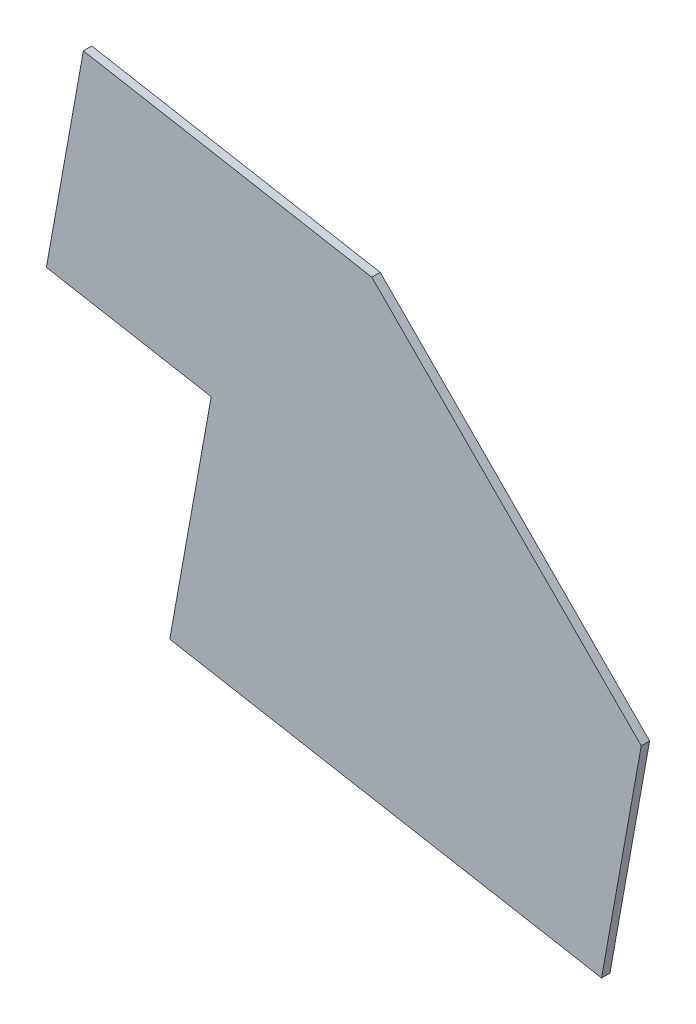
ISO-10303-21;
HEADER;
FILE_DESCRIPTION(('STEP AP214'),'2;1');
FILE_NAME('part.step','',(''),(''),'','','');
FILE_SCHEMA(('AUTOMOTIVE_DESIGN { 1 0 10303 214 1 1 1 1 }'));
ENDSEC;
DATA;
#1=APPLICATION_CONTEXT('core data for automotive mechanical design processes');
#2=APPLICATION_PROTOCOL_DEFINITION('international standard','automotive_design',2000,#1);
#3=PRODUCT_CONTEXT('',#1,'mechanical');
#4=PRODUCT('Part','Part','',(#3));
#5=PRODUCT_RELATED_PRODUCT_CATEGORY('part','',(#4));
#6=PRODUCT_DEFINITION_FORMATION('','',#4);
#7=PRODUCT_DEFINITION_CONTEXT('part definition',#1,'design');
#8=PRODUCT_DEFINITION('design','',#6,#7);
#9=PRODUCT_DEFINITION_SHAPE('','',#8);
#10=(LENGTH_UNIT() NAMED_UNIT(*) SI_UNIT(.MILLI.,.METRE.));
#11=(NAMED_UNIT(*) PLANE_ANGLE_UNIT() SI_UNIT($,.RADIAN.));
#12=(NAMED_UNIT(*) SI_UNIT($,.STERADIAN.) SOLID_ANGLE_UNIT());
#13=UNCERTAINTY_MEASURE_WITH_UNIT(LENGTH_MEASURE(1.E-05),#10,'distance_accuracy_value','');
#14=(GEOMETRIC_REPRESENTATION_CONTEXT(3) GLOBAL_UNCERTAINTY_ASSIGNED_CONTEXT((#13)) GLOBAL_UNIT_ASSIGNED_CONTEXT((#10,
#11,#12)) REPRESENTATION_CONTEXT('',''));
#15=CARTESIAN_POINT('',(0.,0.,0.));
#16=DIRECTION('',(0.,0.,1.));
#17=DIRECTION('',(1.,0.,0.));
#18=AXIS2_PLACEMENT_3D('',#15,#16,#17);
#19=CARTESIAN_POINT('',(6.90259130912156,36.5974267215923,-9.14292260314349));
#20=DIRECTION('',(0.,0.,1.));
#21=DIRECTION('',(1.,0.,0.));
#22=AXIS2_PLACEMENT_3D('',#19,#20,#21);
#23=PLANE('',#22);
#24=DIRECTION('',(0.704896981963478,-0.709309695985315,0.));
#25=VECTOR('',#24,1.);
#26=CARTESIAN_POINT('',(12.4671356279618,42.4369671593034,-9.14292260314354));
#27=LINE('',#26,#25);
#28=CARTESIAN_POINT('',(16.5544350594565,38.3240808917542,-9.14292260314354));
#29=VERTEX_POINT('',#28);
#30=CARTESIAN_POINT('',(12.4671356279618,42.4369671593034,-9.14292260314352));
#31=VERTEX_POINT('',#30);
#32=EDGE_CURVE('E130',#29,#31,#27,.F.);
#33=ORIENTED_EDGE('',*,*,#32,.T.);
#34=DIRECTION('',(0.984261131481025,-0.176720188591154,0.));
#35=VECTOR('',#34,1.);
#36=CARTESIAN_POINT('',(8.09209489852861,43.2224883975911,-9.14292260314351));
#37=LINE('',#36,#35);
#38=CARTESIAN_POINT('',(8.09209489852861,43.2224883975911,-9.14292260314349));
#39=VERTEX_POINT('',#38);
#40=EDGE_CURVE('E137',#31,#39,#37,.F.);
#41=ORIENTED_EDGE('',*,*,#40,.T.);
#42=DIRECTION('',(0.176720188591154,0.984261131481025,0.));
#43=VECTOR('',#42,1.);
#44=CARTESIAN_POINT('',(7.53100829975169,40.0974593051388,-9.14292260314348));
#45=LINE('',#44,#43);
#46=CARTESIAN_POINT('',(7.53100829975169,40.0974593051388,-9.14292260314349));
#47=VERTEX_POINT('',#46);
#48=EDGE_CURVE('E92',#39,#47,#45,.F.);
#49=ORIENTED_EDGE('',*,*,#48,.T.);
#50=DIRECTION('',(-0.984261131481025,0.176720188591154,0.));
#51=VECTOR('',#50,1.);
#52=CARTESIAN_POINT('',(10.0310315737135,39.6485900261173,-9.14292260314349));
#53=LINE('',#52,#51);
#54=CARTESIAN_POINT('',(10.0310315737135,39.6485900261173,-9.14292260314349));
#55=VERTEX_POINT('',#54);
#56=EDGE_CURVE('E20',#47,#55,#53,.F.);
#57=ORIENTED_EDGE('',*,*,#56,.T.);
#58=DIRECTION('',(0.176720188591154,0.984261131481025,0.));
#59=VECTOR('',#58,1.);
#60=CARTESIAN_POINT('',(9.40261458308336,36.1485574425708,-9.1429226031435));
#61=LINE('',#60,#59);
#62=CARTESIAN_POINT('',(9.40261458308336,36.1485574425707,-9.14292260314351));
#63=VERTEX_POINT('',#62);
#64=EDGE_CURVE('E88',#55,#63,#61,.F.);
#65=ORIENTED_EDGE('',*,*,#64,.T.);
#66=DIRECTION('',(-0.984261131481025,0.176720188591154,0.));
#67=VECTOR('',#66,1.);
#68=CARTESIAN_POINT('',(15.9526755608633,34.9725199315343,-9.14292260314351));
#69=LINE('',#68,#67);
#70=CARTESIAN_POINT('',(15.9526755608633,34.9725199315343,-9.14292260314353));
#71=VERTEX_POINT('',#70);
#72=EDGE_CURVE('E117',#63,#71,#69,.F.);
#73=ORIENTED_EDGE('',*,*,#72,.T.);
#74=DIRECTION('',(-0.176720188591155,-0.984261131481025,0.));
#75=VECTOR('',#74,1.);
#76=CARTESIAN_POINT('',(16.5544350594565,38.3240808917542,-9.14292260314354));
#77=LINE('',#76,#75);
#78=EDGE_CURVE('E123',#71,#29,#77,.F.);
#79=ORIENTED_EDGE('',*,*,#78,.T.);
#80=EDGE_LOOP('',(#33,#41,#49,#57,#65,#73,#79));
#81=FACE_BOUND('',#80,.T.);
#82=ADVANCED_FACE('F17',(#81),#23,.T.);
#83=CARTESIAN_POINT('',(10.0310315737135,39.6485900261173,-9.2699226031435));
#84=DIRECTION('',(0.176720188591154,0.984261131481025,0.));
#85=DIRECTION('',(-0.984261131481025,0.176720188591154,0.));
#86=AXIS2_PLACEMENT_3D('',#83,#84,#85);
#87=PLANE('',#86);
#88=DIRECTION('',(0.,0.,1.));
#89=VECTOR('',#88,1.);
#90=CARTESIAN_POINT('',(7.53100829975169,40.0974593051388,-9.26992260314349));
#91=LINE('',#90,#89);
#92=CARTESIAN_POINT('',(7.53100829975169,40.0974593051388,-9.26992260314349));
#93=VERTEX_POINT('',#92);
#94=EDGE_CURVE('E140',#47,#93,#91,.F.);
#95=ORIENTED_EDGE('',*,*,#94,.T.);
#96=DIRECTION('',(0.984261131481024,-0.176720188591159,0.));
#97=VECTOR('',#96,1.);
#98=CARTESIAN_POINT('',(7.53100829975169,40.0974593051388,-9.26992260314348));
#99=LINE('',#98,#97);
#100=CARTESIAN_POINT('',(10.0310315737135,39.6485900261173,-9.2699226031435));
#101=VERTEX_POINT('',#100);
#102=EDGE_CURVE('E109',#93,#101,#99,.T.);
#103=ORIENTED_EDGE('',*,*,#102,.T.);
#104=DIRECTION('',(0.,0.,1.));
#105=VECTOR('',#104,1.);
#106=CARTESIAN_POINT('',(10.0310315737135,39.6485900261173,-9.26992260314351));
#107=LINE('',#106,#105);
#108=EDGE_CURVE('E98',#101,#55,#107,.T.);
#109=ORIENTED_EDGE('',*,*,#108,.T.);
#110=ORIENTED_EDGE('',*,*,#56,.F.);
#111=EDGE_LOOP('',(#95,#103,#109,#110));
#112=FACE_BOUND('',#111,.T.);
#113=ADVANCED_FACE('F108',(#112),#87,.F.);
#114=CARTESIAN_POINT('',(9.40261458308336,36.1485574425708,-9.26992260314351));
#115=DIRECTION('',(0.984261131481025,-0.176720188591154,0.));
#116=DIRECTION('',(0.176720188591154,0.984261131481025,0.));
#117=AXIS2_PLACEMENT_3D('',#114,#115,#116);
#118=PLANE('',#117);
#119=ORIENTED_EDGE('',*,*,#108,.F.);
#120=DIRECTION('',(-0.176720188591155,-0.984261131481024,0.));
#121=VECTOR('',#120,1.);
#122=CARTESIAN_POINT('',(10.0310315737135,39.6485900261173,-9.2699226031435));
#123=LINE('',#122,#121);
#124=CARTESIAN_POINT('',(9.40261458308336,36.1485574425707,-9.26992260314351));
#125=VERTEX_POINT('',#124);
#126=EDGE_CURVE('E149',#101,#125,#123,.T.);
#127=ORIENTED_EDGE('',*,*,#126,.T.);
#128=DIRECTION('',(0.,0.,1.));
#129=VECTOR('',#128,1.);
#130=CARTESIAN_POINT('',(9.40261458308335,36.1485574425707,-9.26992260314354));
#131=LINE('',#130,#129);
#132=EDGE_CURVE('E104',#125,#63,#131,.T.);
#133=ORIENTED_EDGE('',*,*,#132,.T.);
#134=ORIENTED_EDGE('',*,*,#64,.F.);
#135=EDGE_LOOP('',(#119,#127,#133,#134));
#136=FACE_BOUND('',#135,.T.);
#137=ADVANCED_FACE('F101',(#136),#118,.F.);
#138=CARTESIAN_POINT('',(15.9526755608633,34.9725199315343,-9.26992260314354));
#139=DIRECTION('',(0.176720188591154,0.984261131481025,0.));
#140=DIRECTION('',(-0.984261131481025,0.176720188591154,0.));
#141=AXIS2_PLACEMENT_3D('',#138,#139,#140);
#142=PLANE('',#141);
#143=ORIENTED_EDGE('',*,*,#132,.F.);
#144=DIRECTION('',(0.984261131481023,-0.176720188591161,0.));
#145=VECTOR('',#144,1.);
#146=CARTESIAN_POINT('',(9.40261458308336,36.1485574425708,-9.2699226031435));
#147=LINE('',#146,#145);
#148=CARTESIAN_POINT('',(15.9526755608633,34.9725199315343,-9.26992260314354));
#149=VERTEX_POINT('',#148);
#150=EDGE_CURVE('E151',#125,#149,#147,.T.);
#151=ORIENTED_EDGE('',*,*,#150,.T.);
#152=DIRECTION('',(0.,0.,1.));
#153=VECTOR('',#152,1.);
#154=CARTESIAN_POINT('',(15.9526755608633,34.9725199315343,-9.26992260314354));
#155=LINE('',#154,#153);
#156=EDGE_CURVE('E119',#149,#71,#155,.T.);
#157=ORIENTED_EDGE('',*,*,#156,.T.);
#158=ORIENTED_EDGE('',*,*,#72,.F.);
#159=EDGE_LOOP('',(#143,#151,#157,#158));
#160=FACE_BOUND('',#159,.T.);
#161=ADVANCED_FACE('F181',(#160),#142,.F.);
#162=CARTESIAN_POINT('',(16.5544350594565,38.3240808917542,-9.26992260314354));
#163=DIRECTION('',(-0.984261131481025,0.176720188591155,0.));
#164=DIRECTION('',(-0.176720188591155,-0.984261131481025,0.));
#165=AXIS2_PLACEMENT_3D('',#162,#163,#164);
#166=PLANE('',#165);
#167=ORIENTED_EDGE('',*,*,#156,.F.);
#168=DIRECTION('',(0.176720188591167,0.984261131481022,0.));
#169=VECTOR('',#168,1.);
#170=CARTESIAN_POINT('',(15.9526755608633,34.9725199315343,-9.26992260314354));
#171=LINE('',#170,#169);
#172=CARTESIAN_POINT('',(16.5544350594565,38.3240808917542,-9.26992260314353));
#173=VERTEX_POINT('',#172);
#174=EDGE_CURVE('E155',#149,#173,#171,.T.);
#175=ORIENTED_EDGE('',*,*,#174,.T.);
#176=DIRECTION('',(0.,0.,1.));
#177=VECTOR('',#176,1.);
#178=CARTESIAN_POINT('',(16.5544350594565,38.3240808917541,-9.26992260314351));
#179=LINE('',#178,#177);
#180=EDGE_CURVE('E126',#173,#29,#179,.T.);
#181=ORIENTED_EDGE('',*,*,#180,.T.);
#182=ORIENTED_EDGE('',*,*,#78,.F.);
#183=EDGE_LOOP('',(#167,#175,#181,#182));
#184=FACE_BOUND('',#183,.T.);
#185=ADVANCED_FACE('F178',(#184),#166,.F.);
#186=CARTESIAN_POINT('',(12.4671356279618,42.4369671593034,-9.26992260314351));
#187=DIRECTION('',(-0.709309695985315,-0.704896981963478,0.));
#188=DIRECTION('',(0.704896981963478,-0.709309695985315,0.));
#189=AXIS2_PLACEMENT_3D('',#186,#187,#188);
#190=PLANE('',#189);
#191=ORIENTED_EDGE('',*,*,#180,.F.);
#192=DIRECTION('',(-0.70489698196348,0.709309695985312,0.));
#193=VECTOR('',#192,1.);
#194=CARTESIAN_POINT('',(16.5544350594565,38.3240808917542,-9.26992260314353));
#195=LINE('',#194,#193);
#196=CARTESIAN_POINT('',(12.4671356279618,42.4369671593034,-9.2699226031435));
#197=VERTEX_POINT('',#196);
#198=EDGE_CURVE('E159',#173,#197,#195,.T.);
#199=ORIENTED_EDGE('',*,*,#198,.T.);
#200=DIRECTION('',(0.,0.,1.));
#201=VECTOR('',#200,1.);
#202=CARTESIAN_POINT('',(12.4671356279618,42.4369671593034,-9.26992260314349));
#203=LINE('',#202,#201);
#204=EDGE_CURVE('E133',#197,#31,#203,.T.);
#205=ORIENTED_EDGE('',*,*,#204,.T.);
#206=ORIENTED_EDGE('',*,*,#32,.F.);
#207=EDGE_LOOP('',(#191,#199,#205,#206));
#208=FACE_BOUND('',#207,.T.);
#209=ADVANCED_FACE('F174',(#208),#190,.F.);
#210=CARTESIAN_POINT('',(8.09209489852861,43.2224883975911,-9.26992260314349));
#211=DIRECTION('',(-0.176720188591154,-0.984261131481025,0.));
#212=DIRECTION('',(0.984261131481025,-0.176720188591154,0.));
#213=AXIS2_PLACEMENT_3D('',#210,#211,#212);
#214=PLANE('',#213);
#215=ORIENTED_EDGE('',*,*,#204,.F.);
#216=DIRECTION('',(-0.984261131481024,0.17672018859116,0.));
#217=VECTOR('',#216,1.);
#218=CARTESIAN_POINT('',(12.4671356279618,42.4369671593034,-9.2699226031435));
#219=LINE('',#218,#217);
#220=CARTESIAN_POINT('',(8.09209489852861,43.2224883975911,-9.26992260314349));
#221=VERTEX_POINT('',#220);
#222=EDGE_CURVE('E27',#197,#221,#219,.T.);
#223=ORIENTED_EDGE('',*,*,#222,.T.);
#224=DIRECTION('',(0.,0.,1.));
#225=VECTOR('',#224,1.);
#226=CARTESIAN_POINT('',(8.09209489852861,43.2224883975911,-9.26992260314349));
#227=LINE('',#226,#225);
#228=EDGE_CURVE('E39',#221,#39,#227,.T.);
#229=ORIENTED_EDGE('',*,*,#228,.T.);
#230=ORIENTED_EDGE('',*,*,#40,.F.);
#231=EDGE_LOOP('',(#215,#223,#229,#230));
#232=FACE_BOUND('',#231,.T.);
#233=ADVANCED_FACE('F167',(#232),#214,.F.);
#234=CARTESIAN_POINT('',(7.53100829975169,40.0974593051388,-9.26992260314349));
#235=DIRECTION('',(0.984261131481025,-0.176720188591154,0.));
#236=DIRECTION('',(0.176720188591154,0.984261131481025,0.));
#237=AXIS2_PLACEMENT_3D('',#234,#235,#236);
#238=PLANE('',#237);
#239=ORIENTED_EDGE('',*,*,#228,.F.);
#240=DIRECTION('',(-0.176720188591156,-0.984261131481024,0.));
#241=VECTOR('',#240,1.);
#242=CARTESIAN_POINT('',(8.09209489852861,43.2224883975911,-9.26992260314348));
#243=LINE('',#242,#241);
#244=EDGE_CURVE('E11',#221,#93,#243,.T.);
#245=ORIENTED_EDGE('',*,*,#244,.T.);
#246=ORIENTED_EDGE('',*,*,#94,.F.);
#247=ORIENTED_EDGE('',*,*,#48,.F.);
#248=EDGE_LOOP('',(#239,#245,#246,#247));
#249=FACE_BOUND('',#248,.T.);
#250=ADVANCED_FACE('F182',(#249),#238,.F.);
#251=CARTESIAN_POINT('',(6.90259130912155,36.5974267215923,-9.26992260314349));
#252=DIRECTION('',(0.,0.,1.));
#253=DIRECTION('',(1.,0.,0.));
#254=AXIS2_PLACEMENT_3D('',#251,#252,#253);
#255=PLANE('',#254);
#256=ORIENTED_EDGE('',*,*,#222,.F.);
#257=ORIENTED_EDGE('',*,*,#198,.F.);
#258=ORIENTED_EDGE('',*,*,#174,.F.);
#259=ORIENTED_EDGE('',*,*,#150,.F.);
#260=ORIENTED_EDGE('',*,*,#126,.F.);
#261=ORIENTED_EDGE('',*,*,#102,.F.);
#262=ORIENTED_EDGE('',*,*,#244,.F.);
#263=EDGE_LOOP('',(#256,#257,#258,#259,#260,#261,#262));
#264=FACE_BOUND('',#263,.T.);
#265=ADVANCED_FACE('F171',(#264),#255,.F.);
#266=CLOSED_SHELL('',(#82,#113,#137,#161,#185,#209,#233,#250,#265));
#267=MANIFOLD_SOLID_BREP('B1',#266);
#268=ADVANCED_BREP_SHAPE_REPRESENTATION('',(#18,#267),#14);
#269=SHAPE_DEFINITION_REPRESENTATION(#9,#268);
ENDSEC;
END-ISO-10303-21;
